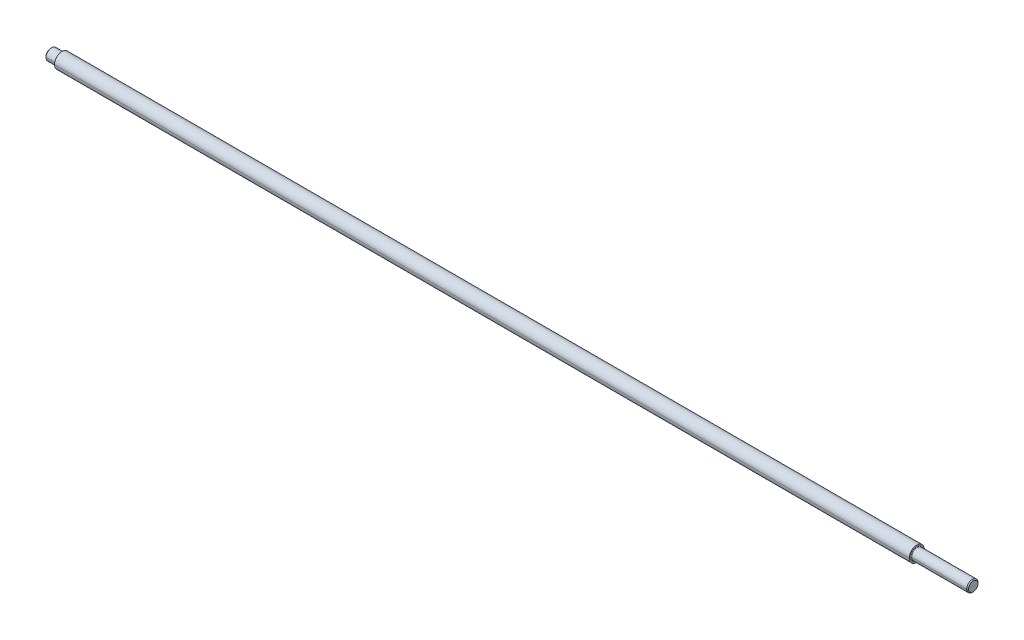
ISO-10303-21;
HEADER;
FILE_DESCRIPTION(('STEP AP214'),'2;1');
FILE_NAME('part.step','',(''),(''),'','','');
FILE_SCHEMA(('AUTOMOTIVE_DESIGN { 1 0 10303 214 1 1 1 1 }'));
ENDSEC;
DATA;
#1=APPLICATION_CONTEXT('core data for automotive mechanical design processes');
#2=APPLICATION_PROTOCOL_DEFINITION('international standard','automotive_design',2000,#1);
#3=PRODUCT_CONTEXT('',#1,'mechanical');
#4=PRODUCT('Part','Part','',(#3));
#5=PRODUCT_RELATED_PRODUCT_CATEGORY('part','',(#4));
#6=PRODUCT_DEFINITION_FORMATION('','',#4);
#7=PRODUCT_DEFINITION_CONTEXT('part definition',#1,'design');
#8=PRODUCT_DEFINITION('design','',#6,#7);
#9=PRODUCT_DEFINITION_SHAPE('','',#8);
#10=(LENGTH_UNIT() NAMED_UNIT(*) SI_UNIT(.MILLI.,.METRE.));
#11=(NAMED_UNIT(*) PLANE_ANGLE_UNIT() SI_UNIT($,.RADIAN.));
#12=(NAMED_UNIT(*) SI_UNIT($,.STERADIAN.) SOLID_ANGLE_UNIT());
#13=UNCERTAINTY_MEASURE_WITH_UNIT(LENGTH_MEASURE(1.E-05),#10,'distance_accuracy_value','');
#14=(GEOMETRIC_REPRESENTATION_CONTEXT(3) GLOBAL_UNCERTAINTY_ASSIGNED_CONTEXT((#13)) GLOBAL_UNIT_ASSIGNED_CONTEXT((#10,
#11,#12)) REPRESENTATION_CONTEXT('',''));
#15=CARTESIAN_POINT('',(0.,0.,0.));
#16=DIRECTION('',(0.,0.,1.));
#17=DIRECTION('',(1.,0.,0.));
#18=AXIS2_PLACEMENT_3D('',#15,#16,#17);
#19=CARTESIAN_POINT('',(6.,0.,0.));
#20=DIRECTION('',(1.,0.,0.));
#21=DIRECTION('',(0.,0.,-1.));
#22=AXIS2_PLACEMENT_3D('',#19,#20,#21);
#23=PLANE('',#22);
#24=CARTESIAN_POINT('',(6.,0.,0.));
#25=DIRECTION('',(1.,0.,0.));
#26=DIRECTION('',(0.,0.,-1.));
#27=AXIS2_PLACEMENT_3D('',#24,#25,#26);
#28=CIRCLE('',#27,4.);
#29=CARTESIAN_POINT('',(6.,0.,4.));
#30=VERTEX_POINT('',#29);
#31=CARTESIAN_POINT('',(6.,0.,-4.));
#32=VERTEX_POINT('',#31);
#33=EDGE_CURVE('E12',#30,#32,#28,.T.);
#34=ORIENTED_EDGE('',*,*,#33,.F.);
#35=CARTESIAN_POINT('',(6.,0.,0.));
#36=DIRECTION('',(1.,0.,0.));
#37=DIRECTION('',(0.,0.,-1.));
#38=AXIS2_PLACEMENT_3D('',#35,#36,#37);
#39=CIRCLE('',#38,4.);
#40=EDGE_CURVE('E30',#32,#30,#39,.T.);
#41=ORIENTED_EDGE('',*,*,#40,.F.);
#42=EDGE_LOOP('',(#34,#41));
#43=FACE_BOUND('',#42,.T.);
#44=CARTESIAN_POINT('',(6.,0.,0.));
#45=DIRECTION('',(1.,0.,0.));
#46=DIRECTION('',(0.,0.,-1.));
#47=AXIS2_PLACEMENT_3D('',#44,#45,#46);
#48=CIRCLE('',#47,3.3);
#49=CARTESIAN_POINT('',(6.,3.13848650377389,1.01975608143729));
#50=VERTEX_POINT('',#49);
#51=CARTESIAN_POINT('',(6.,-3.13848650377389,-1.01975608143729));
#52=VERTEX_POINT('',#51);
#53=EDGE_CURVE('E365',#50,#52,#48,.T.);
#54=ORIENTED_EDGE('',*,*,#53,.T.);
#55=CARTESIAN_POINT('',(6.,-3.13848650377401,-1.01975608143733));
#56=CARTESIAN_POINT('',(6.,-2.81782039903075,-2.00530224482661));
#57=CARTESIAN_POINT('',(6.,-2.11185986041756,-2.86774135735268));
#58=CARTESIAN_POINT('',(6.,-1.07813045412419,-3.39311154185759));
#59=CARTESIAN_POINT('',(6.,1.14525399832329,-3.52472937652373));
#60=CARTESIAN_POINT('',(6.,2.86664678322691,-2.11137572019098));
#61=CARTESIAN_POINT('',(6.,3.39414659405723,-1.07873141270831));
#62=CARTESIAN_POINT('',(6.,3.45835167581034,0.0339496792361995));
#63=CARTESIAN_POINT('',(6.,3.13848650377401,1.01975608143733));
#64=B_SPLINE_CURVE_WITH_KNOTS('',5,(#55,#56,#57,#58,#59,#60,#61,#62,#63),.UNSPECIFIED.,.F.,.F.,
(6,3,6),(0.,1.5707963267949,3.14159265358979),.UNSPECIFIED.);
#65=EDGE_CURVE('E367',#52,#50,#64,.T.);
#66=ORIENTED_EDGE('',*,*,#65,.T.);
#67=EDGE_LOOP('',(#54,#66));
#68=FACE_BOUND('',#67,.T.);
#69=ADVANCED_FACE('F20',(#43,#68),#23,.F.);
#70=CARTESIAN_POINT('',(5.70000000000012,0.,0.));
#71=DIRECTION('',(1.,0.,0.));
#72=DIRECTION('',(0.,-0.309016994374947,0.951056516295154));
#73=AXIS2_PLACEMENT_3D('',#70,#71,#72);
#74=TOROIDAL_SURFACE('',#73,3.29999999999988,0.299999999999877);
#75=CARTESIAN_POINT('',(5.70000000000012,-3.13848650377389,-1.01975608143729));
#76=DIRECTION('',(0.,0.309016994374947,-0.951056516295154));
#77=DIRECTION('',(-3.96719694132885E-13,0.951056516295154,0.309016994374947));
#78=AXIS2_PLACEMENT_3D('',#75,#76,#77);
#79=CIRCLE('',#78,0.299999999999877);
#80=CARTESIAN_POINT('',(5.7,-2.85316954888546,-0.927050983124841));
#81=VERTEX_POINT('',#80);
#82=EDGE_CURVE('E374',#81,#52,#79,.T.);
#83=ORIENTED_EDGE('',*,*,#82,.F.);
#84=CARTESIAN_POINT('',(5.7,0.,0.));
#85=DIRECTION('',(1.,0.,0.));
#86=DIRECTION('',(0.,0.,-1.));
#87=AXIS2_PLACEMENT_3D('',#84,#85,#86);
#88=CIRCLE('',#87,3.);
#89=CARTESIAN_POINT('',(5.7,0.,-3.));
#90=VERTEX_POINT('',#89);
#91=EDGE_CURVE('E379',#81,#90,#88,.T.);
#92=ORIENTED_EDGE('',*,*,#91,.T.);
#93=CARTESIAN_POINT('',(5.7,0.,0.));
#94=DIRECTION('',(1.,0.,0.));
#95=DIRECTION('',(0.,0.,-1.));
#96=AXIS2_PLACEMENT_3D('',#93,#94,#95);
#97=CIRCLE('',#96,3.);
#98=CARTESIAN_POINT('',(5.7,2.85316954888546,0.927050983124841));
#99=VERTEX_POINT('',#98);
#100=EDGE_CURVE('E388',#90,#99,#97,.T.);
#101=ORIENTED_EDGE('',*,*,#100,.T.);
#102=CARTESIAN_POINT('',(5.70000000000012,3.13848650377389,1.01975608143729));
#103=DIRECTION('',(0.,-0.309016994374947,0.951056516295154));
#104=DIRECTION('',(-3.9968028886522E-13,-0.951056516295154,-0.309016994374947));
#105=AXIS2_PLACEMENT_3D('',#102,#103,#104);
#106=CIRCLE('',#105,0.299999999999877);
#107=EDGE_CURVE('E381',#99,#50,#106,.T.);
#108=ORIENTED_EDGE('',*,*,#107,.T.);
#109=ORIENTED_EDGE('',*,*,#65,.F.);
#110=EDGE_LOOP('',(#83,#92,#101,#108,#109));
#111=FACE_BOUND('',#110,.T.);
#112=ADVANCED_FACE('F321',(#111),#74,.F.);
#113=CARTESIAN_POINT('',(5.70000000000012,0.,0.));
#114=DIRECTION('',(1.,0.,0.));
#115=DIRECTION('',(0.,0.309016994374947,-0.951056516295154));
#116=AXIS2_PLACEMENT_3D('',#113,#114,#115);
#117=TOROIDAL_SURFACE('',#116,3.29999999999988,0.299999999999877);
#118=ORIENTED_EDGE('',*,*,#82,.T.);
#119=ORIENTED_EDGE('',*,*,#53,.F.);
#120=ORIENTED_EDGE('',*,*,#107,.F.);
#121=CARTESIAN_POINT('',(5.7,0.,0.));
#122=DIRECTION('',(1.,0.,0.));
#123=DIRECTION('',(0.,0.,-1.));
#124=AXIS2_PLACEMENT_3D('',#121,#122,#123);
#125=CIRCLE('',#124,3.);
#126=CARTESIAN_POINT('',(5.7,0.,3.));
#127=VERTEX_POINT('',#126);
#128=EDGE_CURVE('E313',#99,#127,#125,.T.);
#129=ORIENTED_EDGE('',*,*,#128,.T.);
#130=CARTESIAN_POINT('',(5.7,0.,0.));
#131=DIRECTION('',(1.,0.,0.));
#132=DIRECTION('',(0.,0.,-1.));
#133=AXIS2_PLACEMENT_3D('',#130,#131,#132);
#134=CIRCLE('',#133,3.);
#135=EDGE_CURVE('E376',#127,#81,#134,.T.);
#136=ORIENTED_EDGE('',*,*,#135,.T.);
#137=EDGE_LOOP('',(#118,#119,#120,#129,#136));
#138=FACE_BOUND('',#137,.T.);
#139=ADVANCED_FACE('F330',(#138),#117,.F.);
#140=CARTESIAN_POINT('',(6.,0.,0.));
#141=DIRECTION('',(1.,0.,0.));
#142=DIRECTION('',(0.,1.,-1.61702923845784E-09));
#143=AXIS2_PLACEMENT_3D('',#140,#141,#142);
#144=CYLINDRICAL_SURFACE('',#143,3.);
#145=DIRECTION('',(1.,0.,0.));
#146=VECTOR('',#145,1.);
#147=CARTESIAN_POINT('',(0.5,0.,3.));
#148=LINE('',#147,#146);
#149=CARTESIAN_POINT('',(0.5,0.,3.));
#150=VERTEX_POINT('',#149);
#151=EDGE_CURVE('E395',#150,#127,#148,.T.);
#152=ORIENTED_EDGE('',*,*,#151,.F.);
#153=CARTESIAN_POINT('',(0.5,0.,0.));
#154=DIRECTION('',(1.,0.,0.));
#155=DIRECTION('',(0.,0.,-1.));
#156=AXIS2_PLACEMENT_3D('',#153,#154,#155);
#157=CIRCLE('',#156,3.);
#158=CARTESIAN_POINT('',(0.5,0.,-3.));
#159=VERTEX_POINT('',#158);
#160=EDGE_CURVE('E399',#150,#159,#157,.T.);
#161=ORIENTED_EDGE('',*,*,#160,.T.);
#162=DIRECTION('',(1.,0.,0.));
#163=VECTOR('',#162,1.);
#164=CARTESIAN_POINT('',(0.5,0.,-3.));
#165=LINE('',#164,#163);
#166=EDGE_CURVE('E402',#159,#90,#165,.T.);
#167=ORIENTED_EDGE('',*,*,#166,.T.);
#168=ORIENTED_EDGE('',*,*,#91,.F.);
#169=ORIENTED_EDGE('',*,*,#135,.F.);
#170=EDGE_LOOP('',(#152,#161,#167,#168,#169));
#171=FACE_BOUND('',#170,.T.);
#172=ADVANCED_FACE('F334',(#171),#144,.T.);
#173=CARTESIAN_POINT('',(6.,0.,0.));
#174=DIRECTION('',(1.,0.,0.));
#175=DIRECTION('',(0.,-1.,0.));
#176=AXIS2_PLACEMENT_3D('',#173,#174,#175);
#177=CYLINDRICAL_SURFACE('',#176,3.);
#178=ORIENTED_EDGE('',*,*,#151,.T.);
#179=ORIENTED_EDGE('',*,*,#128,.F.);
#180=ORIENTED_EDGE('',*,*,#100,.F.);
#181=ORIENTED_EDGE('',*,*,#166,.F.);
#182=CARTESIAN_POINT('',(0.5,0.,0.));
#183=DIRECTION('',(1.,0.,0.));
#184=DIRECTION('',(0.,0.,-1.));
#185=AXIS2_PLACEMENT_3D('',#182,#183,#184);
#186=CIRCLE('',#185,3.);
#187=EDGE_CURVE('E406',#159,#150,#186,.T.);
#188=ORIENTED_EDGE('',*,*,#187,.T.);
#189=EDGE_LOOP('',(#178,#179,#180,#181,#188));
#190=FACE_BOUND('',#189,.T.);
#191=ADVANCED_FACE('F338',(#190),#177,.T.);
#192=CARTESIAN_POINT('',(0.,0.,0.));
#193=DIRECTION('',(1.,0.,0.));
#194=DIRECTION('',(0.,-1.,0.));
#195=AXIS2_PLACEMENT_3D('',#192,#193,#194);
#196=CONICAL_SURFACE('',#195,2.5,0.785398163397448);
#197=DIRECTION('',(0.707106781186548,0.,0.707106781186547));
#198=VECTOR('',#197,1.);
#199=CARTESIAN_POINT('',(0.,0.,2.5));
#200=LINE('',#199,#198);
#201=CARTESIAN_POINT('',(0.,0.,2.5));
#202=VERTEX_POINT('',#201);
#203=EDGE_CURVE('E410',#202,#150,#200,.T.);
#204=ORIENTED_EDGE('',*,*,#203,.T.);
#205=ORIENTED_EDGE('',*,*,#187,.F.);
#206=DIRECTION('',(0.707106781186548,0.,-0.707106781186547));
#207=VECTOR('',#206,1.);
#208=CARTESIAN_POINT('',(0.,0.,-2.5));
#209=LINE('',#208,#207);
#210=CARTESIAN_POINT('',(0.,0.,-2.5));
#211=VERTEX_POINT('',#210);
#212=EDGE_CURVE('E414',#211,#159,#209,.T.);
#213=ORIENTED_EDGE('',*,*,#212,.F.);
#214=CARTESIAN_POINT('',(0.,0.,0.));
#215=DIRECTION('',(1.,0.,0.));
#216=DIRECTION('',(0.,0.,-1.));
#217=AXIS2_PLACEMENT_3D('',#214,#215,#216);
#218=CIRCLE('',#217,2.5);
#219=EDGE_CURVE('E418',#211,#202,#218,.T.);
#220=ORIENTED_EDGE('',*,*,#219,.T.);
#221=EDGE_LOOP('',(#204,#205,#213,#220));
#222=FACE_BOUND('',#221,.T.);
#223=ADVANCED_FACE('F342',(#222),#196,.T.);
#224=CARTESIAN_POINT('',(0.,0.,0.));
#225=DIRECTION('',(1.,0.,0.));
#226=DIRECTION('',(0.,0.,-1.));
#227=AXIS2_PLACEMENT_3D('',#224,#225,#226);
#228=PLANE('',#227);
#229=CARTESIAN_POINT('',(0.,0.,0.));
#230=DIRECTION('',(1.,0.,0.));
#231=DIRECTION('',(0.,0.,-1.));
#232=AXIS2_PLACEMENT_3D('',#229,#230,#231);
#233=CIRCLE('',#232,2.5);
#234=EDGE_CURVE('E421',#202,#211,#233,.T.);
#235=ORIENTED_EDGE('',*,*,#234,.F.);
#236=ORIENTED_EDGE('',*,*,#219,.F.);
#237=EDGE_LOOP('',(#235,#236));
#238=FACE_BOUND('',#237,.T.);
#239=ADVANCED_FACE('F346',(#238),#228,.F.);
#240=CARTESIAN_POINT('',(0.,0.,0.));
#241=DIRECTION('',(1.,0.,0.));
#242=DIRECTION('',(0.,1.,0.));
#243=AXIS2_PLACEMENT_3D('',#240,#241,#242);
#244=CONICAL_SURFACE('',#243,2.5,0.785398163397448);
#245=ORIENTED_EDGE('',*,*,#203,.F.);
#246=ORIENTED_EDGE('',*,*,#234,.T.);
#247=ORIENTED_EDGE('',*,*,#212,.T.);
#248=ORIENTED_EDGE('',*,*,#160,.F.);
#249=EDGE_LOOP('',(#245,#246,#247,#248));
#250=FACE_BOUND('',#249,.T.);
#251=ADVANCED_FACE('F350',(#250),#244,.T.);
#252=CARTESIAN_POINT('',(460.,0.,0.));
#253=DIRECTION('',(1.,0.,0.));
#254=DIRECTION('',(0.,-1.,0.));
#255=AXIS2_PLACEMENT_3D('',#252,#253,#254);
#256=CYLINDRICAL_SURFACE('',#255,4.);
#257=DIRECTION('',(1.,0.,0.));
#258=VECTOR('',#257,1.);
#259=CARTESIAN_POINT('',(6.,0.,4.));
#260=LINE('',#259,#258);
#261=CARTESIAN_POINT('',(460.,0.,4.));
#262=VERTEX_POINT('',#261);
#263=EDGE_CURVE('E425',#30,#262,#260,.T.);
#264=ORIENTED_EDGE('',*,*,#263,.T.);
#265=CARTESIAN_POINT('',(460.,0.,0.));
#266=DIRECTION('',(1.,0.,0.));
#267=DIRECTION('',(0.,0.,-1.));
#268=AXIS2_PLACEMENT_3D('',#265,#266,#267);
#269=CIRCLE('',#268,4.);
#270=CARTESIAN_POINT('',(460.,0.,-4.));
#271=VERTEX_POINT('',#270);
#272=EDGE_CURVE('E256',#271,#262,#269,.T.);
#273=ORIENTED_EDGE('',*,*,#272,.F.);
#274=DIRECTION('',(1.,0.,0.));
#275=VECTOR('',#274,1.);
#276=CARTESIAN_POINT('',(6.,0.,-4.));
#277=LINE('',#276,#275);
#278=EDGE_CURVE('E250',#32,#271,#277,.T.);
#279=ORIENTED_EDGE('',*,*,#278,.F.);
#280=ORIENTED_EDGE('',*,*,#40,.T.);
#281=EDGE_LOOP('',(#264,#273,#279,#280));
#282=FACE_BOUND('',#281,.T.);
#283=ADVANCED_FACE('F353',(#282),#256,.T.);
#284=CARTESIAN_POINT('',(460.,0.,0.));
#285=DIRECTION('',(1.,0.,0.));
#286=DIRECTION('',(0.,1.,0.));
#287=AXIS2_PLACEMENT_3D('',#284,#285,#286);
#288=CYLINDRICAL_SURFACE('',#287,4.);
#289=ORIENTED_EDGE('',*,*,#263,.F.);
#290=ORIENTED_EDGE('',*,*,#33,.T.);
#291=ORIENTED_EDGE('',*,*,#278,.T.);
#292=CARTESIAN_POINT('',(460.,0.,0.));
#293=DIRECTION('',(1.,0.,0.));
#294=DIRECTION('',(0.,0.,-1.));
#295=AXIS2_PLACEMENT_3D('',#292,#293,#294);
#296=CIRCLE('',#295,4.);
#297=EDGE_CURVE('E247',#262,#271,#296,.T.);
#298=ORIENTED_EDGE('',*,*,#297,.F.);
#299=EDGE_LOOP('',(#289,#290,#291,#298));
#300=FACE_BOUND('',#299,.T.);
#301=ADVANCED_FACE('F212',(#300),#288,.T.);
#302=CARTESIAN_POINT('',(460.,4.,0.));
#303=DIRECTION('',(-1.,0.,0.));
#304=DIRECTION('',(0.,0.,1.));
#305=AXIS2_PLACEMENT_3D('',#302,#303,#304);
#306=PLANE('',#305);
#307=CARTESIAN_POINT('',(460.,3.13848650376745,1.0197560814352));
#308=CARTESIAN_POINT('',(460.,3.121801856387,1.07110985257108));
#309=CARTESIAN_POINT('',(460.,3.10385469802414,1.12205330654476));
#310=CARTESIAN_POINT('',(460.,3.06548330202971,1.22299864190109));
#311=CARTESIAN_POINT('',(460.,3.04505906439813,1.27300052328375));
#312=CARTESIAN_POINT('',(460.,3.00178145256234,1.37194177519145));
#313=CARTESIAN_POINT('',(460.,2.97892807835812,1.42088114571649));
#314=CARTESIAN_POINT('',(460.,2.93084758706294,1.51757960512147));
#315=CARTESIAN_POINT('',(460.,2.90562046997198,1.56533869400141));
#316=CARTESIAN_POINT('',(460.,2.85285317669646,1.65956149987176));
#317=CARTESIAN_POINT('',(460.,2.8253130005119,1.70602521686217));
#318=CARTESIAN_POINT('',(460.,2.76798596000637,1.79754535301127));
#319=CARTESIAN_POINT('',(460.,2.73819909568541,1.84260177216996));
#320=CARTESIAN_POINT('',(460.,2.67645043157167,1.9311987653244));
#321=CARTESIAN_POINT('',(460.,2.64448863177889,1.97473933932016));
#322=CARTESIAN_POINT('',(460.,2.57846709723856,2.0601997497544));
#323=CARTESIAN_POINT('',(460.,2.54440736249101,2.10211958619287));
#324=CARTESIAN_POINT('',(460.,2.47427201045871,2.18423753277739));
#325=CARTESIAN_POINT('',(460.,2.43819639317396,2.22443564292344));
#326=CARTESIAN_POINT('',(460.,2.36411618551421,2.30301329620238));
#327=CARTESIAN_POINT('',(460.,2.3261115951392,2.34139283933526));
#328=CARTESIAN_POINT('',(460.,2.24826499765245,2.41624089889407));
#329=CARTESIAN_POINT('',(460.,2.2084229905407,2.45270941531999));
#330=CARTESIAN_POINT('',(460.,2.12699754247432,2.52364756561795));
#331=CARTESIAN_POINT('',(460.,2.08541410151969,2.55811719949));
#332=CARTESIAN_POINT('',(460.,2.00060596391668,2.6249745443121));
#333=CARTESIAN_POINT('',(460.,1.9573812672683,2.65736225526216));
#334=CARTESIAN_POINT('',(460.,1.8693947503587,2.71997772940804));
#335=CARTESIAN_POINT('',(460.,1.82463293009748,2.75020549260386));
#336=CARTESIAN_POINT('',(460.,1.7336800011077,2.80842824991202));
#337=CARTESIAN_POINT('',(460.,1.68748889237914,2.83642324402436));
#338=CARTESIAN_POINT('',(460.,1.59378866488153,2.89011302077267));
#339=CARTESIAN_POINT('',(460.,1.54627954611248,2.91580780340866));
#340=CARTESIAN_POINT('',(460.,1.45005775216228,2.96483525622229));
#341=CARTESIAN_POINT('',(460.,1.40134507698114,2.98816792639994));
#342=CARTESIAN_POINT('',(460.,1.30283352330801,3.03241494385077));
#343=CARTESIAN_POINT('',(460.,1.25303464481602,3.05332929112394));
#344=CARTESIAN_POINT('',(460.,1.15247065438135,3.09268927827133));
#345=CARTESIAN_POINT('',(460.,1.10170554243867,3.11113491814555));
#346=CARTESIAN_POINT('',(460.,0.999331382703779,3.14551305333295));
#347=CARTESIAN_POINT('',(460.,0.947722334911572,3.16144554864612));
#348=CARTESIAN_POINT('',(460.,0.843784634194184,3.19075901193469));
#349=CARTESIAN_POINT('',(460.,0.791455981269002,3.20413997991008));
#350=CARTESIAN_POINT('',(460.,0.686205134594009,3.22831815259919));
#351=CARTESIAN_POINT('',(460.,0.633282940844198,3.23911535731291));
#352=CARTESIAN_POINT('',(460.,0.526972506720127,3.25809999206681));
#353=CARTESIAN_POINT('',(460.,0.473584266345866,3.26628742210698));
#354=CARTESIAN_POINT('',(460.,0.366470355920216,3.28003278327768));
#355=CARTESIAN_POINT('',(460.,0.312744685868825,3.28559071440821));
#356=CARTESIAN_POINT('',(460.,0.20508534593388,3.2940636882167));
#357=CARTESIAN_POINT('',(460.,0.151151676050325,3.29697873089467));
#358=CARTESIAN_POINT('',(460.,0.0432062673858348,3.3001589052049));
#359=CARTESIAN_POINT('',(460.,-0.0108054713951013,3.30042403683717));
#360=CARTESIAN_POINT('',(460.,-0.118776898844764,3.29830375033068));
#361=CARTESIAN_POINT('',(460.,-0.172736587513491,3.29591833219193));
#362=CARTESIAN_POINT('',(460.,-0.280473921122419,3.28850269282463));
#363=CARTESIAN_POINT('',(460.,-0.334251566062621,3.28347247159609));
#364=CARTESIAN_POINT('',(460.,-0.441495257157476,3.27077934429274));
#365=CARTESIAN_POINT('',(460.,-0.494961303312129,3.26311643821795));
#366=CARTESIAN_POINT('',(460.,-0.601452992447624,3.24517640183402));
#367=CARTESIAN_POINT('',(460.,-0.654478635428467,3.2348992715249));
#368=CARTESIAN_POINT('',(460.,-0.759961774797904,3.2117555451794));
#369=CARTESIAN_POINT('',(460.,-0.812419271186498,3.19888894914303));
#370=CARTESIAN_POINT('',(460.,-0.916639742667906,3.17059728809988));
#371=CARTESIAN_POINT('',(460.,-0.968402717760719,3.1551722230931));
#372=CARTESIAN_POINT('',(460.,-1.07110944510966,3.12180078444181));
#373=CARTESIAN_POINT('',(460.,-1.12205319736579,3.10385441079729));
#374=CARTESIAN_POINT('',(460.,-1.22299875108004,3.06548358925656));
#375=CARTESIAN_POINT('',(460.,-1.27300055253816,3.04505914136034));
#376=CARTESIAN_POINT('',(460.,-1.37194174593703,3.00178137560014));
#377=CARTESIAN_POINT('',(460.,-1.42088113787779,2.97892805773616));
#378=CARTESIAN_POINT('',(460.,-1.51757961296016,2.9308476076849));
#379=CARTESIAN_POINT('',(460.,-1.56533869610177,2.90562047549762));
#380=CARTESIAN_POINT('',(460.,-1.65956149777138,2.85285317117082));
#381=CARTESIAN_POINT('',(460.,-1.70602521629937,2.82531299903131));
#382=CARTESIAN_POINT('',(460.,-1.79754535357406,2.76798596148697));
#383=CARTESIAN_POINT('',(460.,-1.84260177232075,2.73819909608214));
#384=CARTESIAN_POINT('',(460.,-1.9311987651736,2.67645043117495));
#385=CARTESIAN_POINT('',(460.,-1.97473933927975,2.64448863167259));
#386=CARTESIAN_POINT('',(460.,-2.0601997497948,2.57846709734487));
#387=CARTESIAN_POINT('',(460.,-2.10211958620369,2.5444073625195));
#388=CARTESIAN_POINT('',(460.,-2.18423753276656,2.47427201043023));
#389=CARTESIAN_POINT('',(460.,-2.22443564292053,2.43819639316634));
#390=CARTESIAN_POINT('',(460.,-2.30301329620527,2.36411618552184));
#391=CARTESIAN_POINT('',(460.,-2.34139283933603,2.32611159514125));
#392=CARTESIAN_POINT('',(460.,-2.41624089889329,2.24826499765041));
#393=CARTESIAN_POINT('',(460.,-2.45270941531978,2.20842299054016));
#394=CARTESIAN_POINT('',(460.,-2.52364756561816,2.12699754247488));
#395=CARTESIAN_POINT('',(460.,-2.55811719949005,2.08541410151984));
#396=CARTESIAN_POINT('',(460.,-2.62497454431204,2.00060596391654));
#397=CARTESIAN_POINT('',(460.,-2.65736225526214,1.95738126726827));
#398=CARTESIAN_POINT('',(460.,-2.71997772940805,1.86939475035874));
#399=CARTESIAN_POINT('',(460.,-2.75020549260386,1.82463293009749));
#400=CARTESIAN_POINT('',(460.,-2.80842824991201,1.73368000110769));
#401=CARTESIAN_POINT('',(460.,-2.83642324402435,1.68748889237914));
#402=CARTESIAN_POINT('',(460.,-2.89011302077267,1.59378866488154));
#403=CARTESIAN_POINT('',(460.,-2.91580780340865,1.54627954611248));
#404=CARTESIAN_POINT('',(460.,-2.96483525622229,1.45005775216229));
#405=CARTESIAN_POINT('',(460.,-2.98816792639994,1.40134507698115));
#406=CARTESIAN_POINT('',(460.,-3.03241494385077,1.30283352330801));
#407=CARTESIAN_POINT('',(460.,-3.05332929112395,1.25303464481602));
#408=CARTESIAN_POINT('',(460.,-3.09268927827132,1.15247065438136));
#409=CARTESIAN_POINT('',(460.,-3.11113491814551,1.10170554243869));
#410=CARTESIAN_POINT('',(460.,-3.14551305333299,0.999331382703775));
#411=CARTESIAN_POINT('',(460.,-3.16144554864627,0.947722334911537));
#412=CARTESIAN_POINT('',(460.,-3.19075901193453,0.843784634194231));
#413=CARTESIAN_POINT('',(460.,-3.20413997990951,0.791455981269163));
#414=CARTESIAN_POINT('',(460.,-3.22831815259975,0.686205134593863));
#415=CARTESIAN_POINT('',(460.,-3.23911535731502,0.633282940843632));
#416=CARTESIAN_POINT('',(460.,-3.25809999206469,0.526972506720707));
#417=CARTESIAN_POINT('',(460.,-3.2662874220991,0.473584266348013));
#418=CARTESIAN_POINT('',(460.,-3.28003278328556,0.366470355918084));
#419=CARTESIAN_POINT('',(460.,-3.28559071443761,0.312744685860849));
#420=CARTESIAN_POINT('',(460.,-3.29406368818729,0.205085345941869));
#421=CARTESIAN_POINT('',(460.,-3.29697873078491,0.151151676080125));
#422=CARTESIAN_POINT('',(460.,-3.30015890531465,0.0432062673560489));
#423=CARTESIAN_POINT('',(460.,-3.30042403724676,-0.0108054715062829));
#424=CARTESIAN_POINT('',(460.,-3.29830374992109,-0.118776898733569));
#425=CARTESIAN_POINT('',(460.,-3.2959183306633,-0.172736587098524));
#426=CARTESIAN_POINT('',(460.,-3.28850269435325,-0.280473921537372));
#427=CARTESIAN_POINT('',(460.,-3.28347247730099,-0.334251567611265));
#428=CARTESIAN_POINT('',(460.,-3.27077933858784,-0.441495255608817));
#429=CARTESIAN_POINT('',(460.,-3.26311641692696,-0.494961297532475));
#430=CARTESIAN_POINT('',(460.,-3.24517642312501,-0.60145299822726));
#431=CARTESIAN_POINT('',(460.,-3.23489935098394,-0.654478656998388));
#432=CARTESIAN_POINT('',(460.,-3.21175546572036,-0.759961753227966));
#433=CARTESIAN_POINT('',(460.,-3.19888865259785,-0.812419190686416));
#434=CARTESIAN_POINT('',(460.,-3.17059758464507,-0.916639823167974));
#435=CARTESIAN_POINT('',(460.,-3.15517332981479,-0.968403018191082));
#436=CARTESIAN_POINT('',(460.,-3.13848650376746,-1.01975608143519));
#437=B_SPLINE_CURVE_WITH_KNOTS('',3,(#307,#308,#309,#310,#311,#312,#313,#314,#315,#316,#317,
#318,#319,#320,#321,#322,#323,#324,#325,#326,#327,#328,#329,#330,#331,#332,#333,#334,#335,#336,
#337,#338,#339,#340,#341,#342,#343,#344,#345,#346,#347,#348,#349,#350,#351,#352,#353,#354,#355,
#356,#357,#358,#359,#360,#361,#362,#363,#364,#365,#366,#367,#368,#369,#370,#371,#372,#373,#374,
#375,#376,#377,#378,#379,#380,#381,#382,#383,#384,#385,#386,#387,#388,#389,#390,#391,#392,#393,
#394,#395,#396,#397,#398,#399,#400,#401,#402,#403,#404,#405,#406,#407,#408,#409,#410,#411,#412,
#413,#414,#415,#416,#417,#418,#419,#420,#421,#422,#423,#424,#425,#426,#427,#428,#429,#430,#431,
#432,#433,#434,#435,#436),.UNSPECIFIED.,.F.,.F.,(4,2,2,2,2,2,2,2,2,2,2,2,2,2,2,2,2,2,2,2,2,2,2,
2,2,2,2,2,2,2,2,2,2,2,2,2,2,2,2,2,2,2,2,2,2,2,2,2,2,2,2,2,2,2,2,2,2,2,2,2,2,2,2,2,4),(0.,
0.161972108250883,0.323944216501765,0.485916324752648,0.647888433003531,0.809860541254413,
0.971832649505296,1.13380475775618,1.29577686600706,1.45774897425795,1.61972108250883,
1.78169319075971,1.94366529901059,2.10563740726147,2.26760951551236,2.42958162376324,
2.59155373201412,2.75352584026501,2.91549794851589,3.07747005676677,3.23944216501765,
3.40141427326854,3.56338638151942,3.7253584897703,3.88733059802118,4.04930270627207,
4.21127481452295,4.37324692277383,4.53521903102472,4.6971911392756,4.85916324752648,
5.02113535577736,5.18310746402825,5.34507957227913,5.50705168053001,5.66902378878089,
5.83099589703178,5.99296800528266,6.15494011353354,6.31691222178442,6.47888433003531,
6.64085643828619,6.80282854653707,6.96480065478796,7.12677276303884,7.28874487128972,
7.4507169795406,7.61268908779148,7.77466119604237,7.93663330429325,8.09860541254414,
8.26057752079502,8.4225496290459,8.58452173729678,8.74649384554767,8.90846595379855,
9.07043806204943,9.23241017030032,9.3943822785512,9.55635438680208,9.71832649505296,
9.88029860330384,10.0422707115547,10.2042428198056,10.3662149280565),.UNSPECIFIED.);
#438=CARTESIAN_POINT('',(460.,3.13848650376745,1.0197560814352));
#439=VERTEX_POINT('',#438);
#440=CARTESIAN_POINT('',(460.,-3.13848650376745,-1.0197560814352));
#441=VERTEX_POINT('',#440);
#442=EDGE_CURVE('E236',#439,#441,#437,.T.);
#443=ORIENTED_EDGE('',*,*,#442,.F.);
#444=CARTESIAN_POINT('',(460.,-3.13848650376745,-1.0197560814352));
#445=CARTESIAN_POINT('',(460.,-3.121801856387,-1.07110985257108));
#446=CARTESIAN_POINT('',(460.,-3.10385469802414,-1.12205330654476));
#447=CARTESIAN_POINT('',(460.,-3.06548330202971,-1.22299864190109));
#448=CARTESIAN_POINT('',(460.,-3.04505906439813,-1.27300052328375));
#449=CARTESIAN_POINT('',(460.,-3.00178145256234,-1.37194177519145));
#450=CARTESIAN_POINT('',(460.,-2.97892807835812,-1.42088114571649));
#451=CARTESIAN_POINT('',(460.,-2.93084758706294,-1.51757960512146));
#452=CARTESIAN_POINT('',(460.,-2.90562046997198,-1.56533869400141));
#453=CARTESIAN_POINT('',(460.,-2.85285317669646,-1.65956149987176));
#454=CARTESIAN_POINT('',(460.,-2.8253130005119,-1.70602521686217));
#455=CARTESIAN_POINT('',(460.,-2.76798596000637,-1.79754535301127));
#456=CARTESIAN_POINT('',(460.,-2.73819909568541,-1.84260177216996));
#457=CARTESIAN_POINT('',(460.,-2.67645043157167,-1.9311987653244));
#458=CARTESIAN_POINT('',(460.,-2.64448863177889,-1.97473933932016));
#459=CARTESIAN_POINT('',(460.,-2.57846709723856,-2.0601997497544));
#460=CARTESIAN_POINT('',(460.,-2.54440736249101,-2.10211958619287));
#461=CARTESIAN_POINT('',(460.,-2.47427201045871,-2.18423753277739));
#462=CARTESIAN_POINT('',(460.,-2.43819639317396,-2.22443564292344));
#463=CARTESIAN_POINT('',(460.,-2.36411618551421,-2.30301329620237));
#464=CARTESIAN_POINT('',(460.,-2.3261115951392,-2.34139283933526));
#465=CARTESIAN_POINT('',(460.,-2.24826499765245,-2.41624089889407));
#466=CARTESIAN_POINT('',(460.,-2.2084229905407,-2.45270941531999));
#467=CARTESIAN_POINT('',(460.,-2.12699754247432,-2.52364756561795));
#468=CARTESIAN_POINT('',(460.,-2.08541410151969,-2.55811719948999));
#469=CARTESIAN_POINT('',(460.,-2.00060596391668,-2.62497454431209));
#470=CARTESIAN_POINT('',(460.,-1.9573812672683,-2.65736225526216));
#471=CARTESIAN_POINT('',(460.,-1.8693947503587,-2.71997772940804));
#472=CARTESIAN_POINT('',(460.,-1.82463293009748,-2.75020549260386));
#473=CARTESIAN_POINT('',(460.,-1.7336800011077,-2.80842824991202));
#474=CARTESIAN_POINT('',(460.,-1.68748889237914,-2.83642324402435));
#475=CARTESIAN_POINT('',(460.,-1.59378866488153,-2.89011302077267));
#476=CARTESIAN_POINT('',(460.,-1.54627954611248,-2.91580780340865));
#477=CARTESIAN_POINT('',(460.,-1.45005775216228,-2.96483525622229));
#478=CARTESIAN_POINT('',(460.,-1.40134507698114,-2.98816792639994));
#479=CARTESIAN_POINT('',(460.,-1.30283352330801,-3.03241494385077));
#480=CARTESIAN_POINT('',(460.,-1.25303464481602,-3.05332929112394));
#481=CARTESIAN_POINT('',(460.,-1.15247065438135,-3.09268927827133));
#482=CARTESIAN_POINT('',(460.,-1.10170554243867,-3.11113491814555));
#483=CARTESIAN_POINT('',(460.,-0.999331382703782,-3.14551305333295));
#484=CARTESIAN_POINT('',(460.,-0.947722334911575,-3.16144554864612));
#485=CARTESIAN_POINT('',(460.,-0.843784634194186,-3.19075901193468));
#486=CARTESIAN_POINT('',(460.,-0.791455981269005,-3.20413997991007));
#487=CARTESIAN_POINT('',(460.,-0.686205134594012,-3.22831815259919));
#488=CARTESIAN_POINT('',(460.,-0.633282940844201,-3.23911535731291));
#489=CARTESIAN_POINT('',(460.,-0.52697250672013,-3.25809999206681));
#490=CARTESIAN_POINT('',(460.,-0.473584266345869,-3.26628742210698));
#491=CARTESIAN_POINT('',(460.,-0.366470355920219,-3.28003278327768));
#492=CARTESIAN_POINT('',(460.,-0.312744685868828,-3.28559071440821));
#493=CARTESIAN_POINT('',(460.,-0.205085345933883,-3.2940636882167));
#494=CARTESIAN_POINT('',(460.,-0.151151676050329,-3.29697873089466));
#495=CARTESIAN_POINT('',(460.,-0.0432062673858374,-3.3001589052049));
#496=CARTESIAN_POINT('',(460.,0.0108054713950991,-3.30042403683717));
#497=CARTESIAN_POINT('',(460.,0.118776898844762,-3.29830375033068));
#498=CARTESIAN_POINT('',(460.,0.172736587513488,-3.29591833219193));
#499=CARTESIAN_POINT('',(460.,0.280473921122416,-3.28850269282463));
#500=CARTESIAN_POINT('',(460.,0.334251566062618,-3.28347247159609));
#501=CARTESIAN_POINT('',(460.,0.441495257157472,-3.27077934429274));
#502=CARTESIAN_POINT('',(460.,0.494961303312124,-3.26311643821795));
#503=CARTESIAN_POINT('',(460.,0.601452992447619,-3.24517640183402));
#504=CARTESIAN_POINT('',(460.,0.654478635428463,-3.2348992715249));
#505=CARTESIAN_POINT('',(460.,0.759961774797901,-3.2117555451794));
#506=CARTESIAN_POINT('',(460.,0.812419271186496,-3.19888894914303));
#507=CARTESIAN_POINT('',(460.,0.916639742667903,-3.17059728809988));
#508=CARTESIAN_POINT('',(460.,0.968402717760716,-3.1551722230931));
#509=CARTESIAN_POINT('',(460.,1.07110944510966,-3.12180078444181));
#510=CARTESIAN_POINT('',(460.,1.12205319736579,-3.10385441079729));
#511=CARTESIAN_POINT('',(460.,1.22299875108004,-3.06548358925656));
#512=CARTESIAN_POINT('',(460.,1.27300055253816,-3.04505914136034));
#513=CARTESIAN_POINT('',(460.,1.37194174593703,-3.00178137560014));
#514=CARTESIAN_POINT('',(460.,1.42088113787778,-2.97892805773616));
#515=CARTESIAN_POINT('',(460.,1.51757961296015,-2.9308476076849));
#516=CARTESIAN_POINT('',(460.,1.56533869610177,-2.90562047549762));
#517=CARTESIAN_POINT('',(460.,1.65956149777138,-2.85285317117082));
#518=CARTESIAN_POINT('',(460.,1.70602521629937,-2.82531299903131));
#519=CARTESIAN_POINT('',(460.,1.79754535357406,-2.76798596148697));
#520=CARTESIAN_POINT('',(460.,1.84260177232075,-2.73819909608214));
#521=CARTESIAN_POINT('',(460.,1.93119876517359,-2.67645043117495));
#522=CARTESIAN_POINT('',(460.,1.97473933927975,-2.6444886316726));
#523=CARTESIAN_POINT('',(460.,2.0601997497948,-2.57846709734487));
#524=CARTESIAN_POINT('',(460.,2.10211958620369,-2.5444073625195));
#525=CARTESIAN_POINT('',(460.,2.18423753276656,-2.47427201043024));
#526=CARTESIAN_POINT('',(460.,2.22443564292053,-2.43819639316634));
#527=CARTESIAN_POINT('',(460.,2.30301329620527,-2.36411618552185));
#528=CARTESIAN_POINT('',(460.,2.34139283933603,-2.32611159514125));
#529=CARTESIAN_POINT('',(460.,2.41624089889328,-2.24826499765041));
#530=CARTESIAN_POINT('',(460.,2.45270941531978,-2.20842299054016));
#531=CARTESIAN_POINT('',(460.,2.52364756561815,-2.12699754247488));
#532=CARTESIAN_POINT('',(460.,2.55811719949004,-2.08541410151985));
#533=CARTESIAN_POINT('',(460.,2.62497454431203,-2.00060596391654));
#534=CARTESIAN_POINT('',(460.,2.65736225526214,-1.95738126726827));
#535=CARTESIAN_POINT('',(460.,2.71997772940805,-1.86939475035875));
#536=CARTESIAN_POINT('',(460.,2.75020549260386,-1.8246329300975));
#537=CARTESIAN_POINT('',(460.,2.80842824991201,-1.7336800011077));
#538=CARTESIAN_POINT('',(460.,2.83642324402435,-1.68748889237915));
#539=CARTESIAN_POINT('',(460.,2.89011302077267,-1.59378866488154));
#540=CARTESIAN_POINT('',(460.,2.91580780340865,-1.54627954611249));
#541=CARTESIAN_POINT('',(460.,2.96483525622228,-1.45005775216229));
#542=CARTESIAN_POINT('',(460.,2.98816792639994,-1.40134507698115));
#543=CARTESIAN_POINT('',(460.,3.03241494385077,-1.30283352330802));
#544=CARTESIAN_POINT('',(460.,3.05332929112394,-1.25303464481603));
#545=CARTESIAN_POINT('',(460.,3.09268927827132,-1.15247065438136));
#546=CARTESIAN_POINT('',(460.,3.11113491814551,-1.10170554243869));
#547=CARTESIAN_POINT('',(460.,3.14551305333298,-0.999331382703779));
#548=CARTESIAN_POINT('',(460.,3.16144554864627,-0.947722334911542));
#549=CARTESIAN_POINT('',(460.,3.19075901193453,-0.843784634194236));
#550=CARTESIAN_POINT('',(460.,3.20413997990951,-0.791455981269167));
#551=CARTESIAN_POINT('',(460.,3.22831815259975,-0.686205134593867));
#552=CARTESIAN_POINT('',(460.,3.23911535731502,-0.633282940843637));
#553=CARTESIAN_POINT('',(460.,3.25809999206469,-0.526972506720712));
#554=CARTESIAN_POINT('',(460.,3.2662874220991,-0.473584266348017));
#555=CARTESIAN_POINT('',(460.,3.28003278328556,-0.366470355918089));
#556=CARTESIAN_POINT('',(460.,3.28559071443761,-0.312744685860854));
#557=CARTESIAN_POINT('',(460.,3.29406368818729,-0.205085345941876));
#558=CARTESIAN_POINT('',(460.,3.29697873078491,-0.151151676080131));
#559=CARTESIAN_POINT('',(460.,3.30015890531465,-0.0432062673560553));
#560=CARTESIAN_POINT('',(460.,3.30042403724676,0.0108054715062766));
#561=CARTESIAN_POINT('',(460.,3.29830374992109,0.118776898733563));
#562=CARTESIAN_POINT('',(460.,3.2959183306633,0.172736587098517));
#563=CARTESIAN_POINT('',(460.,3.28850269435325,0.280473921537365));
#564=CARTESIAN_POINT('',(460.,3.28347247730099,0.334251567611259));
#565=CARTESIAN_POINT('',(460.,3.27077933858784,0.441495255608812));
#566=CARTESIAN_POINT('',(460.,3.26311641692696,0.494961297532471));
#567=CARTESIAN_POINT('',(460.,3.24517642312501,0.601452998227257));
#568=CARTESIAN_POINT('',(460.,3.23489935098394,0.654478656998385));
#569=CARTESIAN_POINT('',(460.,3.21175546572036,0.759961753227962));
#570=CARTESIAN_POINT('',(460.,3.19888865259785,0.812419190686412));
#571=CARTESIAN_POINT('',(460.,3.17059758464507,0.916639823167969));
#572=CARTESIAN_POINT('',(460.,3.15517332981479,0.968403018191077));
#573=CARTESIAN_POINT('',(460.,3.13848650376746,1.01975608143518));
#574=B_SPLINE_CURVE_WITH_KNOTS('',3,(#444,#445,#446,#447,#448,#449,#450,#451,#452,#453,#454,
#455,#456,#457,#458,#459,#460,#461,#462,#463,#464,#465,#466,#467,#468,#469,#470,#471,#472,#473,
#474,#475,#476,#477,#478,#479,#480,#481,#482,#483,#484,#485,#486,#487,#488,#489,#490,#491,#492,
#493,#494,#495,#496,#497,#498,#499,#500,#501,#502,#503,#504,#505,#506,#507,#508,#509,#510,#511,
#512,#513,#514,#515,#516,#517,#518,#519,#520,#521,#522,#523,#524,#525,#526,#527,#528,#529,#530,
#531,#532,#533,#534,#535,#536,#537,#538,#539,#540,#541,#542,#543,#544,#545,#546,#547,#548,#549,
#550,#551,#552,#553,#554,#555,#556,#557,#558,#559,#560,#561,#562,#563,#564,#565,#566,#567,#568,
#569,#570,#571,#572,#573),.UNSPECIFIED.,.F.,.F.,(4,2,2,2,2,2,2,2,2,2,2,2,2,2,2,2,2,2,2,2,2,2,2,
2,2,2,2,2,2,2,2,2,2,2,2,2,2,2,2,2,2,2,2,2,2,2,2,2,2,2,2,2,2,2,2,2,2,2,2,2,2,2,2,2,4),(0.,
0.161972108250883,0.323944216501765,0.485916324752648,0.64788843300353,0.809860541254413,
0.971832649505296,1.13380475775618,1.29577686600706,1.45774897425794,1.61972108250883,
1.78169319075971,1.94366529901059,2.10563740726147,2.26760951551236,2.42958162376324,
2.59155373201412,2.75352584026501,2.91549794851589,3.07747005676677,3.23944216501765,
3.40141427326853,3.56338638151942,3.7253584897703,3.88733059802118,4.04930270627207,
4.21127481452295,4.37324692277383,4.53521903102471,4.69719113927559,4.85916324752648,
5.02113535577736,5.18310746402824,5.34507957227912,5.50705168053001,5.66902378878089,
5.83099589703177,5.99296800528265,6.15494011353354,6.31691222178442,6.4788843300353,
6.64085643828618,6.80282854653707,6.96480065478795,7.12677276303883,7.28874487128971,
7.4507169795406,7.61268908779148,7.77466119604236,7.93663330429325,8.09860541254413,
8.26057752079501,8.42254962904589,8.58452173729678,8.74649384554766,8.90846595379854,
9.07043806204942,9.2324101703003,9.39438227855119,9.55635438680207,9.71832649505295,
9.88029860330384,10.0422707115547,10.2042428198056,10.3662149280565),.UNSPECIFIED.);
#575=EDGE_CURVE('E233',#441,#439,#574,.T.);
#576=ORIENTED_EDGE('',*,*,#575,.F.);
#577=EDGE_LOOP('',(#443,#576));
#578=FACE_BOUND('',#577,.T.);
#579=ORIENTED_EDGE('',*,*,#272,.T.);
#580=ORIENTED_EDGE('',*,*,#297,.T.);
#581=EDGE_LOOP('',(#579,#580));
#582=FACE_BOUND('',#581,.T.);
#583=ADVANCED_FACE('F207',(#578,#582),#306,.F.);
#584=CARTESIAN_POINT('',(460.299999999993,0.,0.));
#585=DIRECTION('',(1.,0.,0.));
#586=DIRECTION('',(0.,-0.309016994374947,0.951056516295154));
#587=AXIS2_PLACEMENT_3D('',#584,#585,#586);
#588=TOROIDAL_SURFACE('',#587,3.29999999999311,0.299999999993028);
#589=CARTESIAN_POINT('',(460.299999999993,-3.13848650376745,-1.0197560814352));
#590=DIRECTION('',(0.,0.309016994374947,-0.951056516295154));
#591=DIRECTION('',(-1.,0.,0.));
#592=AXIS2_PLACEMENT_3D('',#589,#590,#591);
#593=CIRCLE('',#592,0.29999999999302);
#594=CARTESIAN_POINT('',(460.3,-2.85316954888554,-0.927050983124867));
#595=VERTEX_POINT('',#594);
#596=EDGE_CURVE('E156',#441,#595,#593,.T.);
#597=ORIENTED_EDGE('',*,*,#596,.F.);
#598=ORIENTED_EDGE('',*,*,#575,.T.);
#599=CARTESIAN_POINT('',(460.299999999993,3.13848650376745,1.0197560814352));
#600=DIRECTION('',(0.,-0.309016994374947,0.951056516295154));
#601=DIRECTION('',(-1.,0.,0.));
#602=AXIS2_PLACEMENT_3D('',#599,#600,#601);
#603=CIRCLE('',#602,0.29999999999302);
#604=CARTESIAN_POINT('',(460.3,2.85316954888554,0.927050983124867));
#605=VERTEX_POINT('',#604);
#606=EDGE_CURVE('E152',#439,#605,#603,.T.);
#607=ORIENTED_EDGE('',*,*,#606,.T.);
#608=CARTESIAN_POINT('',(460.3,0.,0.));
#609=DIRECTION('',(1.,0.,0.));
#610=DIRECTION('',(0.,0.,-1.));
#611=AXIS2_PLACEMENT_3D('',#608,#609,#610);
#612=CIRCLE('',#611,3.00000000000008);
#613=CARTESIAN_POINT('',(460.3,0.,-3.00000000000008));
#614=VERTEX_POINT('',#613);
#615=EDGE_CURVE('E150',#614,#605,#612,.T.);
#616=ORIENTED_EDGE('',*,*,#615,.F.);
#617=CARTESIAN_POINT('',(460.3,0.,0.));
#618=DIRECTION('',(1.,0.,0.));
#619=DIRECTION('',(0.,0.,-1.));
#620=AXIS2_PLACEMENT_3D('',#617,#618,#619);
#621=CIRCLE('',#620,3.00000000000008);
#622=EDGE_CURVE('E241',#595,#614,#621,.T.);
#623=ORIENTED_EDGE('',*,*,#622,.F.);
#624=EDGE_LOOP('',(#597,#598,#607,#616,#623));
#625=FACE_BOUND('',#624,.T.);
#626=ADVANCED_FACE('F202',(#625),#588,.F.);
#627=CARTESIAN_POINT('',(490.,0.,0.));
#628=DIRECTION('',(1.,0.,0.));
#629=DIRECTION('',(0.,1.,0.));
#630=AXIS2_PLACEMENT_3D('',#627,#628,#629);
#631=CYLINDRICAL_SURFACE('',#630,3.00000000000009);
#632=DIRECTION('',(1.,0.,0.));
#633=VECTOR('',#632,1.);
#634=CARTESIAN_POINT('',(460.3,0.,3.00000000000009));
#635=LINE('',#634,#633);
#636=CARTESIAN_POINT('',(460.3,0.,3.00000000000009));
#637=VERTEX_POINT('',#636);
#638=CARTESIAN_POINT('',(489.5,0.,3.0000000000001));
#639=VERTEX_POINT('',#638);
#640=EDGE_CURVE('E274',#637,#639,#635,.T.);
#641=ORIENTED_EDGE('',*,*,#640,.F.);
#642=CARTESIAN_POINT('',(460.3,0.,0.));
#643=DIRECTION('',(1.,0.,0.));
#644=DIRECTION('',(0.,0.,-1.));
#645=AXIS2_PLACEMENT_3D('',#642,#643,#644);
#646=CIRCLE('',#645,3.00000000000008);
#647=EDGE_CURVE('E298',#637,#595,#646,.T.);
#648=ORIENTED_EDGE('',*,*,#647,.T.);
#649=ORIENTED_EDGE('',*,*,#622,.T.);
#650=DIRECTION('',(1.,0.,0.));
#651=VECTOR('',#650,1.);
#652=CARTESIAN_POINT('',(460.3,0.,-3.00000000000009));
#653=LINE('',#652,#651);
#654=CARTESIAN_POINT('',(489.5,0.,-3.0000000000001));
#655=VERTEX_POINT('',#654);
#656=EDGE_CURVE('E293',#614,#655,#653,.T.);
#657=ORIENTED_EDGE('',*,*,#656,.T.);
#658=CARTESIAN_POINT('',(489.5,0.,0.));
#659=DIRECTION('',(1.,0.,0.));
#660=DIRECTION('',(0.,0.,-1.));
#661=AXIS2_PLACEMENT_3D('',#658,#659,#660);
#662=CIRCLE('',#661,3.0000000000001);
#663=EDGE_CURVE('E289',#639,#655,#662,.T.);
#664=ORIENTED_EDGE('',*,*,#663,.F.);
#665=EDGE_LOOP('',(#641,#648,#649,#657,#664));
#666=FACE_BOUND('',#665,.T.);
#667=ADVANCED_FACE('F200',(#666),#631,.T.);
#668=CARTESIAN_POINT('',(489.5,0.,0.));
#669=DIRECTION('',(-1.,0.,0.));
#670=DIRECTION('',(0.,1.,0.));
#671=AXIS2_PLACEMENT_3D('',#668,#669,#670);
#672=CONICAL_SURFACE('',#671,3.0000000000001,0.785398163397448);
#673=DIRECTION('',(-0.707106781186548,0.,-0.707106781186547));
#674=VECTOR('',#673,1.);
#675=CARTESIAN_POINT('',(490.,0.,-2.5000000000001));
#676=LINE('',#675,#674);
#677=CARTESIAN_POINT('',(490.,0.,-2.5000000000001));
#678=VERTEX_POINT('',#677);
#679=EDGE_CURVE('E114',#678,#655,#676,.T.);
#680=ORIENTED_EDGE('',*,*,#679,.F.);
#681=CARTESIAN_POINT('',(490.,0.,0.));
#682=DIRECTION('',(1.,0.,0.));
#683=DIRECTION('',(0.,0.,-1.));
#684=AXIS2_PLACEMENT_3D('',#681,#682,#683);
#685=CIRCLE('',#684,2.5000000000001);
#686=CARTESIAN_POINT('',(490.,0.,2.5000000000001));
#687=VERTEX_POINT('',#686);
#688=EDGE_CURVE('E107',#687,#678,#685,.T.);
#689=ORIENTED_EDGE('',*,*,#688,.F.);
#690=DIRECTION('',(-0.707106781186548,0.,0.707106781186547));
#691=VECTOR('',#690,1.);
#692=CARTESIAN_POINT('',(490.,0.,2.5000000000001));
#693=LINE('',#692,#691);
#694=EDGE_CURVE('E112',#687,#639,#693,.T.);
#695=ORIENTED_EDGE('',*,*,#694,.T.);
#696=ORIENTED_EDGE('',*,*,#663,.T.);
#697=EDGE_LOOP('',(#680,#689,#695,#696));
#698=FACE_BOUND('',#697,.T.);
#699=ADVANCED_FACE('F109',(#698),#672,.T.);
#700=CARTESIAN_POINT('',(489.5,0.,0.));
#701=DIRECTION('',(-1.,0.,0.));
#702=DIRECTION('',(0.,-1.,0.));
#703=AXIS2_PLACEMENT_3D('',#700,#701,#702);
#704=CONICAL_SURFACE('',#703,3.0000000000001,0.785398163397448);
#705=ORIENTED_EDGE('',*,*,#679,.T.);
#706=CARTESIAN_POINT('',(489.5,0.,0.));
#707=DIRECTION('',(1.,0.,0.));
#708=DIRECTION('',(0.,0.,-1.));
#709=AXIS2_PLACEMENT_3D('',#706,#707,#708);
#710=CIRCLE('',#709,3.0000000000001);
#711=EDGE_CURVE('E123',#655,#639,#710,.T.);
#712=ORIENTED_EDGE('',*,*,#711,.T.);
#713=ORIENTED_EDGE('',*,*,#694,.F.);
#714=CARTESIAN_POINT('',(490.,0.,0.));
#715=DIRECTION('',(1.,0.,0.));
#716=DIRECTION('',(0.,0.,-1.));
#717=AXIS2_PLACEMENT_3D('',#714,#715,#716);
#718=CIRCLE('',#717,2.5000000000001);
#719=EDGE_CURVE('E119',#678,#687,#718,.T.);
#720=ORIENTED_EDGE('',*,*,#719,.F.);
#721=EDGE_LOOP('',(#705,#712,#713,#720));
#722=FACE_BOUND('',#721,.T.);
#723=ADVANCED_FACE('F127',(#722),#704,.T.);
#724=CARTESIAN_POINT('',(490.,2.5000000000001,0.));
#725=DIRECTION('',(-1.,0.,0.));
#726=DIRECTION('',(0.,0.,1.));
#727=AXIS2_PLACEMENT_3D('',#724,#725,#726);
#728=PLANE('',#727);
#729=ORIENTED_EDGE('',*,*,#719,.T.);
#730=ORIENTED_EDGE('',*,*,#688,.T.);
#731=EDGE_LOOP('',(#729,#730));
#732=FACE_BOUND('',#731,.T.);
#733=ADVANCED_FACE('F120',(#732),#728,.F.);
#734=CARTESIAN_POINT('',(490.,0.,0.));
#735=DIRECTION('',(1.,0.,0.));
#736=DIRECTION('',(0.,-1.,-1.61702857232403E-09));
#737=AXIS2_PLACEMENT_3D('',#734,#735,#736);
#738=CYLINDRICAL_SURFACE('',#737,3.00000000000009);
#739=ORIENTED_EDGE('',*,*,#640,.T.);
#740=ORIENTED_EDGE('',*,*,#711,.F.);
#741=ORIENTED_EDGE('',*,*,#656,.F.);
#742=ORIENTED_EDGE('',*,*,#615,.T.);
#743=CARTESIAN_POINT('',(460.3,0.,0.));
#744=DIRECTION('',(1.,0.,0.));
#745=DIRECTION('',(0.,0.,-1.));
#746=AXIS2_PLACEMENT_3D('',#743,#744,#745);
#747=CIRCLE('',#746,3.00000000000008);
#748=EDGE_CURVE('E124',#605,#637,#747,.T.);
#749=ORIENTED_EDGE('',*,*,#748,.T.);
#750=EDGE_LOOP('',(#739,#740,#741,#742,#749));
#751=FACE_BOUND('',#750,.T.);
#752=ADVANCED_FACE('F189',(#751),#738,.T.);
#753=CARTESIAN_POINT('',(460.299999999993,0.,0.));
#754=DIRECTION('',(1.,0.,0.));
#755=DIRECTION('',(0.,0.309016994374947,-0.951056516295154));
#756=AXIS2_PLACEMENT_3D('',#753,#754,#755);
#757=TOROIDAL_SURFACE('',#756,3.29999999999311,0.299999999993028);
#758=ORIENTED_EDGE('',*,*,#596,.T.);
#759=ORIENTED_EDGE('',*,*,#647,.F.);
#760=ORIENTED_EDGE('',*,*,#748,.F.);
#761=ORIENTED_EDGE('',*,*,#606,.F.);
#762=ORIENTED_EDGE('',*,*,#442,.T.);
#763=EDGE_LOOP('',(#758,#759,#760,#761,#762));
#764=FACE_BOUND('',#763,.T.);
#765=ADVANCED_FACE('F180',(#764),#757,.F.);
#766=CLOSED_SHELL('',(#69,#112,#139,#172,#191,#223,#239,#251,#283,#301,#583,#626,#667,#699,#723,
#733,#752,#765));
#767=MANIFOLD_SOLID_BREP('B1',#766);
#768=ADVANCED_BREP_SHAPE_REPRESENTATION('',(#18,#767),#14);
#769=SHAPE_DEFINITION_REPRESENTATION(#9,#768);
ENDSEC;
END-ISO-10303-21;
